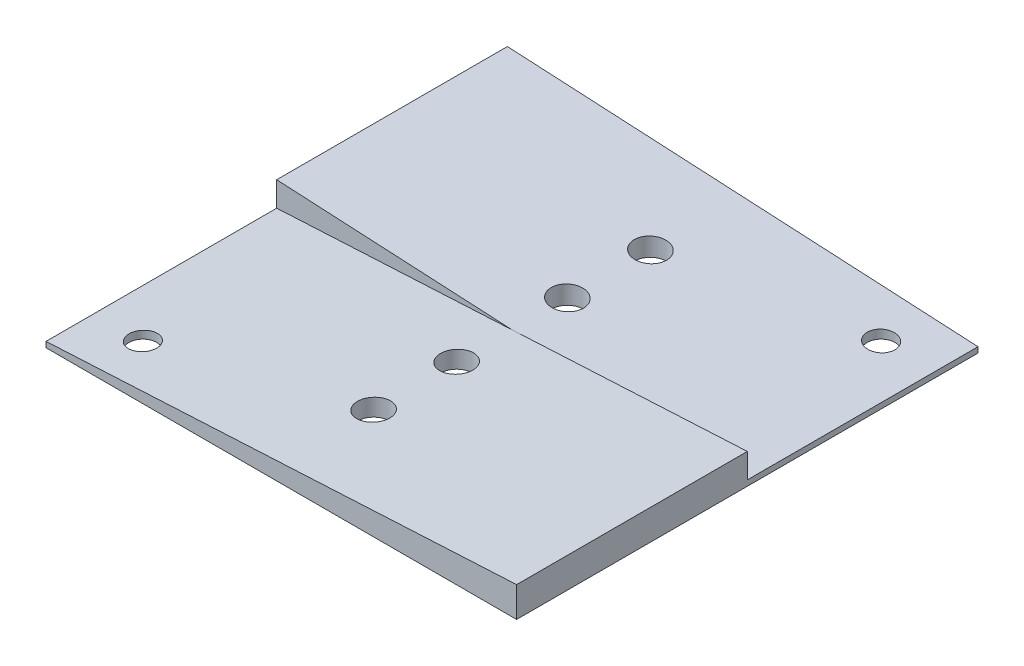
ISO-10303-21;
HEADER;
FILE_DESCRIPTION(('STEP AP214'),'2;1');
FILE_NAME('part.step','',(''),(''),'','','');
FILE_SCHEMA(('AUTOMOTIVE_DESIGN { 1 0 10303 214 1 1 1 1 }'));
ENDSEC;
DATA;
#1=APPLICATION_CONTEXT('core data for automotive mechanical design processes');
#2=APPLICATION_PROTOCOL_DEFINITION('international standard','automotive_design',2000,#1);
#3=PRODUCT_CONTEXT('',#1,'mechanical');
#4=PRODUCT('Part','Part','',(#3));
#5=PRODUCT_RELATED_PRODUCT_CATEGORY('part','',(#4));
#6=PRODUCT_DEFINITION_FORMATION('','',#4);
#7=PRODUCT_DEFINITION_CONTEXT('part definition',#1,'design');
#8=PRODUCT_DEFINITION('design','',#6,#7);
#9=PRODUCT_DEFINITION_SHAPE('','',#8);
#10=(LENGTH_UNIT() NAMED_UNIT(*) SI_UNIT(.MILLI.,.METRE.));
#11=(NAMED_UNIT(*) PLANE_ANGLE_UNIT() SI_UNIT($,.RADIAN.));
#12=(NAMED_UNIT(*) SI_UNIT($,.STERADIAN.) SOLID_ANGLE_UNIT());
#13=UNCERTAINTY_MEASURE_WITH_UNIT(LENGTH_MEASURE(1.E-05),#10,'distance_accuracy_value','');
#14=(GEOMETRIC_REPRESENTATION_CONTEXT(3) GLOBAL_UNCERTAINTY_ASSIGNED_CONTEXT((#13)) GLOBAL_UNIT_ASSIGNED_CONTEXT((#10,
#11,#12)) REPRESENTATION_CONTEXT('',''));
#15=CARTESIAN_POINT('',(0.,0.,0.));
#16=DIRECTION('',(0.,0.,1.));
#17=DIRECTION('',(1.,0.,0.));
#18=AXIS2_PLACEMENT_3D('',#15,#16,#17);
#19=CARTESIAN_POINT('',(-25.5,6.,-25.));
#20=DIRECTION('',(1.,0.,0.));
#21=DIRECTION('',(0.,0.,-1.));
#22=AXIS2_PLACEMENT_3D('',#19,#20,#21);
#23=PLANE('',#22);
#24=DIRECTION('',(0.,-1.,0.));
#25=VECTOR('',#24,1.);
#26=CARTESIAN_POINT('',(-25.5,0.6,0.));
#27=LINE('',#26,#25);
#28=CARTESIAN_POINT('',(-25.5,3.27279674343513,0.));
#29=VERTEX_POINT('',#28);
#30=CARTESIAN_POINT('',(-25.5,0.6,0.));
#31=VERTEX_POINT('',#30);
#32=EDGE_CURVE('E119',#29,#31,#27,.T.);
#33=ORIENTED_EDGE('',*,*,#32,.F.);
#34=DIRECTION('',(0.,0.,-1.));
#35=VECTOR('',#34,1.);
#36=CARTESIAN_POINT('',(-25.5,3.27279674343513,0.));
#37=LINE('',#36,#35);
#38=CARTESIAN_POINT('',(-25.5,3.27279674343513,-25.));
#39=VERTEX_POINT('',#38);
#40=EDGE_CURVE('E53',#29,#39,#37,.T.);
#41=ORIENTED_EDGE('',*,*,#40,.T.);
#42=DIRECTION('',(0.,-1.,0.));
#43=VECTOR('',#42,1.);
#44=CARTESIAN_POINT('',(-25.5,6.,-25.));
#45=LINE('',#44,#43);
#46=CARTESIAN_POINT('',(-25.5,0.,-25.));
#47=VERTEX_POINT('',#46);
#48=EDGE_CURVE('E59',#39,#47,#45,.T.);
#49=ORIENTED_EDGE('',*,*,#48,.T.);
#50=DIRECTION('',(0.,0.,1.));
#51=VECTOR('',#50,1.);
#52=CARTESIAN_POINT('',(-25.5,0.,-25.));
#53=LINE('',#52,#51);
#54=CARTESIAN_POINT('',(-25.5,0.,25.));
#55=VERTEX_POINT('',#54);
#56=EDGE_CURVE('E128',#47,#55,#53,.T.);
#57=ORIENTED_EDGE('',*,*,#56,.T.);
#58=DIRECTION('',(0.,-1.,0.));
#59=VECTOR('',#58,1.);
#60=CARTESIAN_POINT('',(-25.5,6.,25.));
#61=LINE('',#60,#59);
#62=CARTESIAN_POINT('',(-25.5,0.6,25.));
#63=VERTEX_POINT('',#62);
#64=EDGE_CURVE('E45',#63,#55,#61,.T.);
#65=ORIENTED_EDGE('',*,*,#64,.F.);
#66=DIRECTION('',(0.,0.,1.));
#67=VECTOR('',#66,1.);
#68=CARTESIAN_POINT('',(-25.5,0.6,0.));
#69=LINE('',#68,#67);
#70=EDGE_CURVE('E124',#31,#63,#69,.T.);
#71=ORIENTED_EDGE('',*,*,#70,.F.);
#72=EDGE_LOOP('',(#33,#41,#49,#57,#65,#71));
#73=FACE_BOUND('',#72,.T.);
#74=ADVANCED_FACE('F37',(#73),#23,.F.);
#75=CARTESIAN_POINT('',(25.5,6.,25.));
#76=DIRECTION('',(0.,0.,-1.));
#77=DIRECTION('',(-1.,0.,0.));
#78=AXIS2_PLACEMENT_3D('',#75,#76,#77);
#79=PLANE('',#78);
#80=DIRECTION('',(0.,-1.,0.));
#81=VECTOR('',#80,1.);
#82=CARTESIAN_POINT('',(25.5,6.,25.));
#83=LINE('',#82,#81);
#84=CARTESIAN_POINT('',(25.5,3.27279674343513,25.));
#85=VERTEX_POINT('',#84);
#86=CARTESIAN_POINT('',(25.5,0.,25.));
#87=VERTEX_POINT('',#86);
#88=EDGE_CURVE('E140',#85,#87,#83,.T.);
#89=ORIENTED_EDGE('',*,*,#88,.F.);
#90=DIRECTION('',(0.998629534754574,0.0523359562429444,0.));
#91=VECTOR('',#90,1.);
#92=CARTESIAN_POINT('',(-25.5,0.6,25.));
#93=LINE('',#92,#91);
#94=EDGE_CURVE('E115',#63,#85,#93,.T.);
#95=ORIENTED_EDGE('',*,*,#94,.F.);
#96=ORIENTED_EDGE('',*,*,#64,.T.);
#97=DIRECTION('',(1.,0.,0.));
#98=VECTOR('',#97,1.);
#99=CARTESIAN_POINT('',(25.5,0.,25.));
#100=LINE('',#99,#98);
#101=EDGE_CURVE('E131',#55,#87,#100,.T.);
#102=ORIENTED_EDGE('',*,*,#101,.T.);
#103=EDGE_LOOP('',(#89,#95,#96,#102));
#104=FACE_BOUND('',#103,.T.);
#105=ADVANCED_FACE('F193',(#104),#79,.F.);
#106=CARTESIAN_POINT('',(25.5,6.,-25.));
#107=DIRECTION('',(-1.,0.,0.));
#108=DIRECTION('',(0.,0.,1.));
#109=AXIS2_PLACEMENT_3D('',#106,#107,#108);
#110=PLANE('',#109);
#111=DIRECTION('',(0.,-1.,0.));
#112=VECTOR('',#111,1.);
#113=CARTESIAN_POINT('',(25.5,6.,-25.));
#114=LINE('',#113,#112);
#115=CARTESIAN_POINT('',(25.5,0.6,-25.));
#116=VERTEX_POINT('',#115);
#117=CARTESIAN_POINT('',(25.5,0.,-25.));
#118=VERTEX_POINT('',#117);
#119=EDGE_CURVE('E113',#116,#118,#114,.T.);
#120=ORIENTED_EDGE('',*,*,#119,.F.);
#121=DIRECTION('',(0.,0.,-1.));
#122=VECTOR('',#121,1.);
#123=CARTESIAN_POINT('',(25.5,0.6,0.));
#124=LINE('',#123,#122);
#125=CARTESIAN_POINT('',(25.5,0.6,0.));
#126=VERTEX_POINT('',#125);
#127=EDGE_CURVE('E107',#126,#116,#124,.T.);
#128=ORIENTED_EDGE('',*,*,#127,.F.);
#129=DIRECTION('',(0.,-1.,0.));
#130=VECTOR('',#129,1.);
#131=CARTESIAN_POINT('',(25.5,0.6,0.));
#132=LINE('',#131,#130);
#133=CARTESIAN_POINT('',(25.5,3.27279674343513,0.));
#134=VERTEX_POINT('',#133);
#135=EDGE_CURVE('E94',#134,#126,#132,.T.);
#136=ORIENTED_EDGE('',*,*,#135,.F.);
#137=DIRECTION('',(0.,0.,1.));
#138=VECTOR('',#137,1.);
#139=CARTESIAN_POINT('',(25.5,3.27279674343513,0.));
#140=LINE('',#139,#138);
#141=EDGE_CURVE('E126',#134,#85,#140,.T.);
#142=ORIENTED_EDGE('',*,*,#141,.T.);
#143=ORIENTED_EDGE('',*,*,#88,.T.);
#144=DIRECTION('',(0.,0.,-1.));
#145=VECTOR('',#144,1.);
#146=CARTESIAN_POINT('',(25.5,0.,-25.));
#147=LINE('',#146,#145);
#148=EDGE_CURVE('E134',#87,#118,#147,.T.);
#149=ORIENTED_EDGE('',*,*,#148,.T.);
#150=EDGE_LOOP('',(#120,#128,#136,#142,#143,#149));
#151=FACE_BOUND('',#150,.T.);
#152=ADVANCED_FACE('F111',(#151),#110,.F.);
#153=CARTESIAN_POINT('',(25.5,6.,-25.));
#154=DIRECTION('',(0.,0.,1.));
#155=DIRECTION('',(1.,0.,0.));
#156=AXIS2_PLACEMENT_3D('',#153,#154,#155);
#157=PLANE('',#156);
#158=ORIENTED_EDGE('',*,*,#48,.F.);
#159=DIRECTION('',(-0.998629534754574,0.0523359562429444,0.));
#160=VECTOR('',#159,1.);
#161=CARTESIAN_POINT('',(25.5,0.6,-25.));
#162=LINE('',#161,#160);
#163=EDGE_CURVE('E104',#116,#39,#162,.T.);
#164=ORIENTED_EDGE('',*,*,#163,.F.);
#165=ORIENTED_EDGE('',*,*,#119,.T.);
#166=DIRECTION('',(-1.,0.,0.));
#167=VECTOR('',#166,1.);
#168=CARTESIAN_POINT('',(25.5,0.,-25.));
#169=LINE('',#168,#167);
#170=EDGE_CURVE('E136',#118,#47,#169,.T.);
#171=ORIENTED_EDGE('',*,*,#170,.T.);
#172=EDGE_LOOP('',(#158,#164,#165,#171));
#173=FACE_BOUND('',#172,.T.);
#174=ADVANCED_FACE('F182',(#173),#157,.F.);
#175=CARTESIAN_POINT('',(0.,0.,0.));
#176=DIRECTION('',(0.,-1.,0.));
#177=DIRECTION('',(0.,0.,-1.));
#178=AXIS2_PLACEMENT_3D('',#175,#176,#177);
#179=PLANE('',#178);
#180=CARTESIAN_POINT('',(-20.,0.,20.));
#181=DIRECTION('',(0.,-1.,0.));
#182=DIRECTION('',(0.,0.,-1.));
#183=AXIS2_PLACEMENT_3D('',#180,#181,#182);
#184=CIRCLE('',#183,1.5);
#185=CARTESIAN_POINT('',(-20.,0.,18.5));
#186=VERTEX_POINT('',#185);
#187=EDGE_CURVE('E157',#186,#186,#184,.T.);
#188=ORIENTED_EDGE('',*,*,#187,.F.);
#189=EDGE_LOOP('',(#188));
#190=FACE_BOUND('',#189,.T.);
#191=CARTESIAN_POINT('',(20.,0.,-20.));
#192=DIRECTION('',(0.,-1.,0.));
#193=DIRECTION('',(0.,0.,-1.));
#194=AXIS2_PLACEMENT_3D('',#191,#192,#193);
#195=CIRCLE('',#194,1.5);
#196=CARTESIAN_POINT('',(20.,0.,-21.5));
#197=VERTEX_POINT('',#196);
#198=EDGE_CURVE('E163',#197,#197,#195,.T.);
#199=ORIENTED_EDGE('',*,*,#198,.F.);
#200=EDGE_LOOP('',(#199));
#201=FACE_BOUND('',#200,.T.);
#202=CARTESIAN_POINT('',(0.,0.,15.));
#203=DIRECTION('',(0.,-1.,0.));
#204=DIRECTION('',(0.,0.,-1.));
#205=AXIS2_PLACEMENT_3D('',#202,#203,#204);
#206=CIRCLE('',#205,1.75);
#207=CARTESIAN_POINT('',(0.,0.,13.25));
#208=VERTEX_POINT('',#207);
#209=EDGE_CURVE('E173',#208,#208,#206,.T.);
#210=ORIENTED_EDGE('',*,*,#209,.F.);
#211=EDGE_LOOP('',(#210));
#212=FACE_BOUND('',#211,.T.);
#213=CARTESIAN_POINT('',(0.,0.,-15.));
#214=DIRECTION('',(0.,-1.,0.));
#215=DIRECTION('',(0.,0.,-1.));
#216=AXIS2_PLACEMENT_3D('',#213,#214,#215);
#217=CIRCLE('',#216,1.75);
#218=CARTESIAN_POINT('',(0.,0.,-16.75));
#219=VERTEX_POINT('',#218);
#220=EDGE_CURVE('E172',#219,#219,#217,.T.);
#221=ORIENTED_EDGE('',*,*,#220,.F.);
#222=EDGE_LOOP('',(#221));
#223=FACE_BOUND('',#222,.T.);
#224=CARTESIAN_POINT('',(0.,0.,-6.));
#225=DIRECTION('',(0.,-1.,0.));
#226=DIRECTION('',(0.,0.,-1.));
#227=AXIS2_PLACEMENT_3D('',#224,#225,#226);
#228=CIRCLE('',#227,1.75);
#229=CARTESIAN_POINT('',(0.,0.,-7.75));
#230=VERTEX_POINT('',#229);
#231=EDGE_CURVE('E161',#230,#230,#228,.T.);
#232=ORIENTED_EDGE('',*,*,#231,.F.);
#233=EDGE_LOOP('',(#232));
#234=FACE_BOUND('',#233,.T.);
#235=CARTESIAN_POINT('',(0.,0.,6.));
#236=DIRECTION('',(0.,-1.,0.));
#237=DIRECTION('',(0.,0.,-1.));
#238=AXIS2_PLACEMENT_3D('',#235,#236,#237);
#239=CIRCLE('',#238,1.75);
#240=CARTESIAN_POINT('',(0.,0.,4.25));
#241=VERTEX_POINT('',#240);
#242=EDGE_CURVE('E147',#241,#241,#239,.T.);
#243=ORIENTED_EDGE('',*,*,#242,.F.);
#244=EDGE_LOOP('',(#243));
#245=FACE_BOUND('',#244,.T.);
#246=ORIENTED_EDGE('',*,*,#56,.F.);
#247=ORIENTED_EDGE('',*,*,#170,.F.);
#248=ORIENTED_EDGE('',*,*,#148,.F.);
#249=ORIENTED_EDGE('',*,*,#101,.F.);
#250=EDGE_LOOP('',(#246,#247,#248,#249));
#251=FACE_BOUND('',#250,.T.);
#252=ADVANCED_FACE('F188',(#190,#201,#212,#223,#234,#245,#251),#179,.T.);
#253=CARTESIAN_POINT('',(-25.5,0.6,0.));
#254=DIRECTION('',(0.0523359562429444,-0.998629534754574,0.));
#255=DIRECTION('',(0.998629534754574,0.0523359562429444,0.));
#256=AXIS2_PLACEMENT_3D('',#253,#254,#255);
#257=PLANE('',#256);
#258=CARTESIAN_POINT('',(-20.,0.888242786056729,20.));
#259=DIRECTION('',(0.0523359562429444,-0.998629534754574,0.));
#260=DIRECTION('',(-0.998629534754574,-0.0523359562429444,0.));
#261=AXIS2_PLACEMENT_3D('',#258,#259,#260);
#262=ELLIPSE('',#261,1.50205851899688,1.5);
#263=CARTESIAN_POINT('',(-21.5,0.809631117132166,20.));
#264=VERTEX_POINT('',#263);
#265=EDGE_CURVE('E40',#264,#264,#262,.T.);
#266=ORIENTED_EDGE('',*,*,#265,.T.);
#267=EDGE_LOOP('',(#266));
#268=FACE_BOUND('',#267,.T.);
#269=CARTESIAN_POINT('',(0.,1.93639837171756,15.));
#270=DIRECTION('',(0.0523359562429444,-0.998629534754574,0.));
#271=DIRECTION('',(-0.998629534754574,-0.0523359562429444,0.));
#272=AXIS2_PLACEMENT_3D('',#269,#270,#271);
#273=ELLIPSE('',#272,1.75240160549636,1.75);
#274=CARTESIAN_POINT('',(-1.75,1.84468475797224,15.));
#275=VERTEX_POINT('',#274);
#276=EDGE_CURVE('E153',#275,#275,#273,.T.);
#277=ORIENTED_EDGE('',*,*,#276,.T.);
#278=EDGE_LOOP('',(#277));
#279=FACE_BOUND('',#278,.T.);
#280=CARTESIAN_POINT('',(0.,1.93639837171756,6.));
#281=DIRECTION('',(0.0523359562429444,-0.998629534754574,0.));
#282=DIRECTION('',(-0.998629534754574,-0.0523359562429444,0.));
#283=AXIS2_PLACEMENT_3D('',#280,#281,#282);
#284=ELLIPSE('',#283,1.75240160549636,1.75);
#285=CARTESIAN_POINT('',(-1.75,1.84468475797224,6.));
#286=VERTEX_POINT('',#285);
#287=EDGE_CURVE('E150',#286,#286,#284,.T.);
#288=ORIENTED_EDGE('',*,*,#287,.T.);
#289=EDGE_LOOP('',(#288));
#290=FACE_BOUND('',#289,.T.);
#291=ORIENTED_EDGE('',*,*,#94,.T.);
#292=ORIENTED_EDGE('',*,*,#141,.F.);
#293=DIRECTION('',(0.998629534754574,0.0523359562429444,0.));
#294=VECTOR('',#293,1.);
#295=CARTESIAN_POINT('',(-25.5,0.6,0.));
#296=LINE('',#295,#294);
#297=CARTESIAN_POINT('',(-9.92261828258734E-13,1.93639837171762,0.));
#298=VERTEX_POINT('',#297);
#299=EDGE_CURVE('E99',#298,#134,#296,.T.);
#300=ORIENTED_EDGE('',*,*,#299,.F.);
#301=EDGE_CURVE('E121',#31,#298,#296,.T.);
#302=ORIENTED_EDGE('',*,*,#301,.F.);
#303=ORIENTED_EDGE('',*,*,#70,.T.);
#304=EDGE_LOOP('',(#291,#292,#300,#302,#303));
#305=FACE_BOUND('',#304,.T.);
#306=ADVANCED_FACE('F195',(#268,#279,#290,#305),#257,.F.);
#307=CARTESIAN_POINT('',(0.,0.,0.));
#308=DIRECTION('',(0.,0.,-1.));
#309=DIRECTION('',(-1.,0.,0.));
#310=AXIS2_PLACEMENT_3D('',#307,#308,#309);
#311=PLANE('',#310);
#312=ORIENTED_EDGE('',*,*,#301,.T.);
#313=DIRECTION('',(-0.998629534754574,0.0523359562429444,0.));
#314=VECTOR('',#313,1.);
#315=CARTESIAN_POINT('',(0.101204373034813,1.93109447527308,0.));
#316=LINE('',#315,#314);
#317=EDGE_CURVE('E11',#298,#29,#316,.T.);
#318=ORIENTED_EDGE('',*,*,#317,.T.);
#319=ORIENTED_EDGE('',*,*,#32,.T.);
#320=EDGE_LOOP('',(#312,#318,#319));
#321=FACE_BOUND('',#320,.T.);
#322=ADVANCED_FACE('F198',(#321),#311,.F.);
#323=CARTESIAN_POINT('',(0.,0.,0.));
#324=DIRECTION('',(0.,0.,1.));
#325=DIRECTION('',(1.,0.,0.));
#326=AXIS2_PLACEMENT_3D('',#323,#324,#325);
#327=PLANE('',#326);
#328=ORIENTED_EDGE('',*,*,#135,.T.);
#329=DIRECTION('',(-0.998629534754574,0.0523359562429444,0.));
#330=VECTOR('',#329,1.);
#331=CARTESIAN_POINT('',(25.5,0.6,0.));
#332=LINE('',#331,#330);
#333=EDGE_CURVE('E97',#126,#298,#332,.T.);
#334=ORIENTED_EDGE('',*,*,#333,.T.);
#335=ORIENTED_EDGE('',*,*,#299,.T.);
#336=EDGE_LOOP('',(#328,#334,#335));
#337=FACE_BOUND('',#336,.T.);
#338=ADVANCED_FACE('F96',(#337),#327,.F.);
#339=CARTESIAN_POINT('',(25.5,0.6,0.));
#340=DIRECTION('',(-0.0523359562429444,-0.998629534754574,0.));
#341=DIRECTION('',(0.998629534754574,-0.0523359562429444,0.));
#342=AXIS2_PLACEMENT_3D('',#339,#340,#341);
#343=PLANE('',#342);
#344=CARTESIAN_POINT('',(20.,0.888242786056729,-20.));
#345=DIRECTION('',(-0.0523359562429444,-0.998629534754574,0.));
#346=DIRECTION('',(0.998629534754574,-0.0523359562429444,0.));
#347=AXIS2_PLACEMENT_3D('',#344,#345,#346);
#348=ELLIPSE('',#347,1.50205851899688,1.5);
#349=CARTESIAN_POINT('',(21.5,0.809631117132166,-20.));
#350=VERTEX_POINT('',#349);
#351=EDGE_CURVE('E155',#350,#350,#348,.T.);
#352=ORIENTED_EDGE('',*,*,#351,.T.);
#353=EDGE_LOOP('',(#352));
#354=FACE_BOUND('',#353,.T.);
#355=CARTESIAN_POINT('',(0.,1.93639837171756,-15.));
#356=DIRECTION('',(-0.0523359562429444,-0.998629534754574,0.));
#357=DIRECTION('',(0.998629534754574,-0.0523359562429444,0.));
#358=AXIS2_PLACEMENT_3D('',#355,#356,#357);
#359=ELLIPSE('',#358,1.75240160549636,1.75);
#360=CARTESIAN_POINT('',(1.75,1.84468475797224,-15.));
#361=VERTEX_POINT('',#360);
#362=EDGE_CURVE('E146',#361,#361,#359,.T.);
#363=ORIENTED_EDGE('',*,*,#362,.T.);
#364=EDGE_LOOP('',(#363));
#365=FACE_BOUND('',#364,.T.);
#366=CARTESIAN_POINT('',(0.,1.93639837171756,-6.));
#367=DIRECTION('',(-0.0523359562429444,-0.998629534754574,0.));
#368=DIRECTION('',(0.998629534754574,-0.0523359562429444,0.));
#369=AXIS2_PLACEMENT_3D('',#366,#367,#368);
#370=ELLIPSE('',#369,1.75240160549636,1.75);
#371=CARTESIAN_POINT('',(1.75,1.84468475797224,-6.));
#372=VERTEX_POINT('',#371);
#373=EDGE_CURVE('E143',#372,#372,#370,.T.);
#374=ORIENTED_EDGE('',*,*,#373,.T.);
#375=EDGE_LOOP('',(#374));
#376=FACE_BOUND('',#375,.T.);
#377=ORIENTED_EDGE('',*,*,#163,.T.);
#378=ORIENTED_EDGE('',*,*,#40,.F.);
#379=ORIENTED_EDGE('',*,*,#317,.F.);
#380=ORIENTED_EDGE('',*,*,#333,.F.);
#381=ORIENTED_EDGE('',*,*,#127,.T.);
#382=EDGE_LOOP('',(#377,#378,#379,#380,#381));
#383=FACE_BOUND('',#382,.T.);
#384=ADVANCED_FACE('F106',(#354,#365,#376,#383),#343,.F.);
#385=CARTESIAN_POINT('',(0.,3.27279674343513,-6.));
#386=DIRECTION('',(0.,-1.,0.));
#387=DIRECTION('',(0.,0.,-1.));
#388=AXIS2_PLACEMENT_3D('',#385,#386,#387);
#389=CYLINDRICAL_SURFACE('',#388,1.75);
#390=ORIENTED_EDGE('',*,*,#231,.T.);
#391=EDGE_LOOP('',(#390));
#392=FACE_BOUND('',#391,.T.);
#393=ORIENTED_EDGE('',*,*,#373,.F.);
#394=EDGE_LOOP('',(#393));
#395=FACE_BOUND('',#394,.T.);
#396=ADVANCED_FACE('F250',(#392,#395),#389,.F.);
#397=CARTESIAN_POINT('',(0.,3.27279674343513,-15.));
#398=DIRECTION('',(0.,-1.,0.));
#399=DIRECTION('',(0.,0.,-1.));
#400=AXIS2_PLACEMENT_3D('',#397,#398,#399);
#401=CYLINDRICAL_SURFACE('',#400,1.75);
#402=ORIENTED_EDGE('',*,*,#220,.T.);
#403=EDGE_LOOP('',(#402));
#404=FACE_BOUND('',#403,.T.);
#405=ORIENTED_EDGE('',*,*,#362,.F.);
#406=EDGE_LOOP('',(#405));
#407=FACE_BOUND('',#406,.T.);
#408=ADVANCED_FACE('F239',(#404,#407),#401,.F.);
#409=CARTESIAN_POINT('',(0.,3.27279674343513,6.));
#410=DIRECTION('',(0.,-1.,0.));
#411=DIRECTION('',(0.,0.,-1.));
#412=AXIS2_PLACEMENT_3D('',#409,#410,#411);
#413=CYLINDRICAL_SURFACE('',#412,1.75);
#414=ORIENTED_EDGE('',*,*,#242,.T.);
#415=EDGE_LOOP('',(#414));
#416=FACE_BOUND('',#415,.T.);
#417=ORIENTED_EDGE('',*,*,#287,.F.);
#418=EDGE_LOOP('',(#417));
#419=FACE_BOUND('',#418,.T.);
#420=ADVANCED_FACE('F235',(#416,#419),#413,.F.);
#421=CARTESIAN_POINT('',(0.,3.27279674343513,15.));
#422=DIRECTION('',(0.,-1.,0.));
#423=DIRECTION('',(0.,0.,-1.));
#424=AXIS2_PLACEMENT_3D('',#421,#422,#423);
#425=CYLINDRICAL_SURFACE('',#424,1.75);
#426=ORIENTED_EDGE('',*,*,#209,.T.);
#427=EDGE_LOOP('',(#426));
#428=FACE_BOUND('',#427,.T.);
#429=ORIENTED_EDGE('',*,*,#276,.F.);
#430=EDGE_LOOP('',(#429));
#431=FACE_BOUND('',#430,.T.);
#432=ADVANCED_FACE('F238',(#428,#431),#425,.F.);
#433=CARTESIAN_POINT('',(20.,3.27279674343513,-20.));
#434=DIRECTION('',(0.,-1.,0.));
#435=DIRECTION('',(0.,0.,-1.));
#436=AXIS2_PLACEMENT_3D('',#433,#434,#435);
#437=CYLINDRICAL_SURFACE('',#436,1.5);
#438=ORIENTED_EDGE('',*,*,#198,.T.);
#439=EDGE_LOOP('',(#438));
#440=FACE_BOUND('',#439,.T.);
#441=ORIENTED_EDGE('',*,*,#351,.F.);
#442=EDGE_LOOP('',(#441));
#443=FACE_BOUND('',#442,.T.);
#444=ADVANCED_FACE('F247',(#440,#443),#437,.F.);
#445=CARTESIAN_POINT('',(-20.,3.27279674343513,20.));
#446=DIRECTION('',(0.,-1.,0.));
#447=DIRECTION('',(0.,0.,-1.));
#448=AXIS2_PLACEMENT_3D('',#445,#446,#447);
#449=CYLINDRICAL_SURFACE('',#448,1.5);
#450=ORIENTED_EDGE('',*,*,#187,.T.);
#451=EDGE_LOOP('',(#450));
#452=FACE_BOUND('',#451,.T.);
#453=ORIENTED_EDGE('',*,*,#265,.F.);
#454=EDGE_LOOP('',(#453));
#455=FACE_BOUND('',#454,.T.);
#456=ADVANCED_FACE('F270',(#452,#455),#449,.F.);
#457=CLOSED_SHELL('',(#74,#105,#152,#174,#252,#306,#322,#338,#384,#396,#408,#420,#432,#444,#456));
#458=MANIFOLD_SOLID_BREP('B2',#457);
#459=ADVANCED_BREP_SHAPE_REPRESENTATION('',(#18,#458),#14);
#460=SHAPE_DEFINITION_REPRESENTATION(#9,#459);
ENDSEC;
END-ISO-10303-21;
